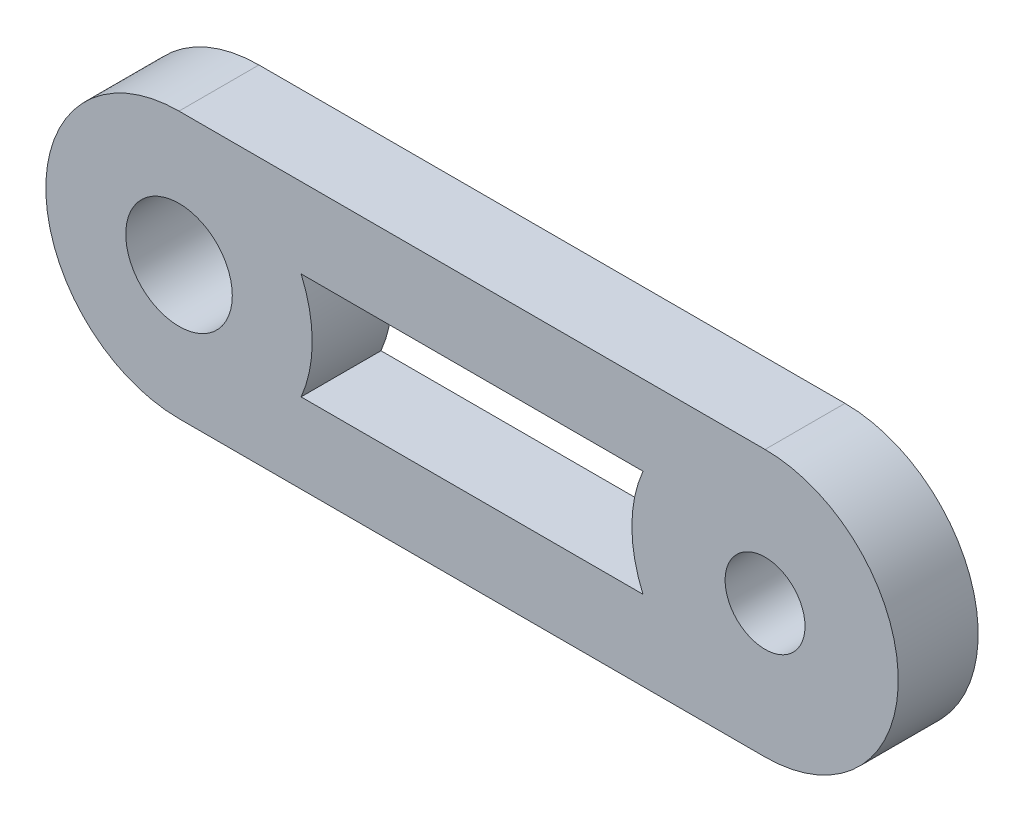
ISO-10303-21;
HEADER;
FILE_DESCRIPTION(('STEP AP214'),'2;1');
FILE_NAME('part.step','',(''),(''),'','','');
FILE_SCHEMA(('AUTOMOTIVE_DESIGN { 1 0 10303 214 1 1 1 1 }'));
ENDSEC;
DATA;
#1=APPLICATION_CONTEXT('core data for automotive mechanical design processes');
#2=APPLICATION_PROTOCOL_DEFINITION('international standard','automotive_design',2000,#1);
#3=PRODUCT_CONTEXT('',#1,'mechanical');
#4=PRODUCT('Part','Part','',(#3));
#5=PRODUCT_RELATED_PRODUCT_CATEGORY('part','',(#4));
#6=PRODUCT_DEFINITION_FORMATION('','',#4);
#7=PRODUCT_DEFINITION_CONTEXT('part definition',#1,'design');
#8=PRODUCT_DEFINITION('design','',#6,#7);
#9=PRODUCT_DEFINITION_SHAPE('','',#8);
#10=(LENGTH_UNIT() NAMED_UNIT(*) SI_UNIT(.MILLI.,.METRE.));
#11=(NAMED_UNIT(*) PLANE_ANGLE_UNIT() SI_UNIT($,.RADIAN.));
#12=(NAMED_UNIT(*) SI_UNIT($,.STERADIAN.) SOLID_ANGLE_UNIT());
#13=UNCERTAINTY_MEASURE_WITH_UNIT(LENGTH_MEASURE(1.E-05),#10,'distance_accuracy_value','');
#14=(GEOMETRIC_REPRESENTATION_CONTEXT(3) GLOBAL_UNCERTAINTY_ASSIGNED_CONTEXT((#13)) GLOBAL_UNIT_ASSIGNED_CONTEXT((#10,
#11,#12)) REPRESENTATION_CONTEXT('',''));
#15=CARTESIAN_POINT('',(0.,0.,0.));
#16=DIRECTION('',(0.,0.,1.));
#17=DIRECTION('',(1.,0.,0.));
#18=AXIS2_PLACEMENT_3D('',#15,#16,#17);
#19=CARTESIAN_POINT('',(11.,-5.,-3.));
#20=DIRECTION('',(0.,1.,0.));
#21=DIRECTION('',(0.,0.,-1.));
#22=AXIS2_PLACEMENT_3D('',#19,#20,#21);
#23=PLANE('',#22);
#24=DIRECTION('',(1.,0.,0.));
#25=VECTOR('',#24,1.);
#26=CARTESIAN_POINT('',(11.,-5.,0.));
#27=LINE('',#26,#25);
#28=CARTESIAN_POINT('',(0.,-5.,0.));
#29=VERTEX_POINT('',#28);
#30=CARTESIAN_POINT('',(22.,-5.,0.));
#31=VERTEX_POINT('',#30);
#32=EDGE_CURVE('E146',#29,#31,#27,.T.);
#33=ORIENTED_EDGE('',*,*,#32,.F.);
#34=DIRECTION('',(0.,0.,1.));
#35=VECTOR('',#34,1.);
#36=CARTESIAN_POINT('',(0.,-5.,-3.));
#37=LINE('',#36,#35);
#38=CARTESIAN_POINT('',(0.,-5.,-3.));
#39=VERTEX_POINT('',#38);
#40=EDGE_CURVE('E143',#39,#29,#37,.T.);
#41=ORIENTED_EDGE('',*,*,#40,.F.);
#42=DIRECTION('',(1.,0.,0.));
#43=VECTOR('',#42,1.);
#44=CARTESIAN_POINT('',(11.,-5.,-3.));
#45=LINE('',#44,#43);
#46=CARTESIAN_POINT('',(22.,-5.,-3.));
#47=VERTEX_POINT('',#46);
#48=EDGE_CURVE('E132',#39,#47,#45,.T.);
#49=ORIENTED_EDGE('',*,*,#48,.T.);
#50=DIRECTION('',(0.,0.,1.));
#51=VECTOR('',#50,1.);
#52=CARTESIAN_POINT('',(22.,-5.,-3.));
#53=LINE('',#52,#51);
#54=EDGE_CURVE('E163',#47,#31,#53,.T.);
#55=ORIENTED_EDGE('',*,*,#54,.T.);
#56=EDGE_LOOP('',(#33,#41,#49,#55));
#57=FACE_BOUND('',#56,.T.);
#58=ADVANCED_FACE('F34',(#57),#23,.F.);
#59=CARTESIAN_POINT('',(22.,0.,-3.));
#60=DIRECTION('',(0.,0.,1.));
#61=DIRECTION('',(-1.,0.,0.));
#62=AXIS2_PLACEMENT_3D('',#59,#60,#61);
#63=CYLINDRICAL_SURFACE('',#62,5.);
#64=CARTESIAN_POINT('',(22.,0.,0.));
#65=DIRECTION('',(0.,0.,1.));
#66=DIRECTION('',(1.,0.,0.));
#67=AXIS2_PLACEMENT_3D('',#64,#65,#66);
#68=CIRCLE('',#67,5.);
#69=CARTESIAN_POINT('',(22.,5.,0.));
#70=VERTEX_POINT('',#69);
#71=EDGE_CURVE('E149',#31,#70,#68,.T.);
#72=ORIENTED_EDGE('',*,*,#71,.F.);
#73=ORIENTED_EDGE('',*,*,#54,.F.);
#74=CARTESIAN_POINT('',(22.,0.,-3.));
#75=DIRECTION('',(0.,0.,1.));
#76=DIRECTION('',(1.,0.,0.));
#77=AXIS2_PLACEMENT_3D('',#74,#75,#76);
#78=CIRCLE('',#77,5.);
#79=CARTESIAN_POINT('',(22.,5.,-3.));
#80=VERTEX_POINT('',#79);
#81=EDGE_CURVE('E136',#47,#80,#78,.T.);
#82=ORIENTED_EDGE('',*,*,#81,.T.);
#83=DIRECTION('',(0.,0.,1.));
#84=VECTOR('',#83,1.);
#85=CARTESIAN_POINT('',(22.,5.,-3.));
#86=LINE('',#85,#84);
#87=EDGE_CURVE('E160',#80,#70,#86,.T.);
#88=ORIENTED_EDGE('',*,*,#87,.T.);
#89=EDGE_LOOP('',(#72,#73,#82,#88));
#90=FACE_BOUND('',#89,.T.);
#91=ADVANCED_FACE('F190',(#90),#63,.T.);
#92=CARTESIAN_POINT('',(11.,5.,-3.));
#93=DIRECTION('',(0.,1.,0.));
#94=DIRECTION('',(0.,0.,-1.));
#95=AXIS2_PLACEMENT_3D('',#92,#93,#94);
#96=PLANE('',#95);
#97=DIRECTION('',(1.,0.,0.));
#98=VECTOR('',#97,1.);
#99=CARTESIAN_POINT('',(11.,5.,0.));
#100=LINE('',#99,#98);
#101=CARTESIAN_POINT('',(0.,5.,0.));
#102=VERTEX_POINT('',#101);
#103=EDGE_CURVE('E152',#102,#70,#100,.T.);
#104=ORIENTED_EDGE('',*,*,#103,.T.);
#105=ORIENTED_EDGE('',*,*,#87,.F.);
#106=DIRECTION('',(1.,0.,0.));
#107=VECTOR('',#106,1.);
#108=CARTESIAN_POINT('',(11.,5.,-3.));
#109=LINE('',#108,#107);
#110=CARTESIAN_POINT('',(0.,5.,-3.));
#111=VERTEX_POINT('',#110);
#112=EDGE_CURVE('E139',#111,#80,#109,.T.);
#113=ORIENTED_EDGE('',*,*,#112,.F.);
#114=DIRECTION('',(0.,0.,1.));
#115=VECTOR('',#114,1.);
#116=CARTESIAN_POINT('',(0.,5.,-3.));
#117=LINE('',#116,#115);
#118=EDGE_CURVE('E157',#111,#102,#117,.T.);
#119=ORIENTED_EDGE('',*,*,#118,.T.);
#120=EDGE_LOOP('',(#104,#105,#113,#119));
#121=FACE_BOUND('',#120,.T.);
#122=ADVANCED_FACE('F195',(#121),#96,.T.);
#123=CARTESIAN_POINT('',(22.,0.,-3.));
#124=DIRECTION('',(0.,0.,1.));
#125=DIRECTION('',(-1.,0.,0.));
#126=AXIS2_PLACEMENT_3D('',#123,#124,#125);
#127=CYLINDRICAL_SURFACE('',#126,1.5);
#128=CARTESIAN_POINT('',(22.,0.,-3.));
#129=DIRECTION('',(0.,0.,1.));
#130=DIRECTION('',(1.,0.,0.));
#131=AXIS2_PLACEMENT_3D('',#128,#129,#130);
#132=CIRCLE('',#131,1.5);
#133=CARTESIAN_POINT('',(23.5,0.,-3.));
#134=VERTEX_POINT('',#133);
#135=EDGE_CURVE('E129',#134,#134,#132,.T.);
#136=ORIENTED_EDGE('',*,*,#135,.F.);
#137=EDGE_LOOP('',(#136));
#138=FACE_BOUND('',#137,.T.);
#139=CARTESIAN_POINT('',(22.,0.,0.));
#140=DIRECTION('',(0.,0.,1.));
#141=DIRECTION('',(1.,0.,0.));
#142=AXIS2_PLACEMENT_3D('',#139,#140,#141);
#143=CIRCLE('',#142,1.5);
#144=CARTESIAN_POINT('',(23.5,0.,0.));
#145=VERTEX_POINT('',#144);
#146=EDGE_CURVE('E126',#145,#145,#143,.T.);
#147=ORIENTED_EDGE('',*,*,#146,.T.);
#148=EDGE_LOOP('',(#147));
#149=FACE_BOUND('',#148,.T.);
#150=ADVANCED_FACE('F36',(#138,#149),#127,.F.);
#151=CARTESIAN_POINT('',(0.,0.,-3.));
#152=DIRECTION('',(0.,0.,1.));
#153=DIRECTION('',(-1.,0.,0.));
#154=AXIS2_PLACEMENT_3D('',#151,#152,#153);
#155=CYLINDRICAL_SURFACE('',#154,5.);
#156=CARTESIAN_POINT('',(0.,0.,0.));
#157=DIRECTION('',(0.,0.,1.));
#158=DIRECTION('',(1.,0.,0.));
#159=AXIS2_PLACEMENT_3D('',#156,#157,#158);
#160=CIRCLE('',#159,5.);
#161=EDGE_CURVE('E133',#29,#102,#160,.F.);
#162=ORIENTED_EDGE('',*,*,#161,.T.);
#163=ORIENTED_EDGE('',*,*,#118,.F.);
#164=CARTESIAN_POINT('',(0.,0.,-3.));
#165=DIRECTION('',(0.,0.,1.));
#166=DIRECTION('',(1.,0.,0.));
#167=AXIS2_PLACEMENT_3D('',#164,#165,#166);
#168=CIRCLE('',#167,5.);
#169=EDGE_CURVE('E141',#39,#111,#168,.F.);
#170=ORIENTED_EDGE('',*,*,#169,.F.);
#171=ORIENTED_EDGE('',*,*,#40,.T.);
#172=EDGE_LOOP('',(#162,#163,#170,#171));
#173=FACE_BOUND('',#172,.T.);
#174=ADVANCED_FACE('F203',(#173),#155,.T.);
#175=CARTESIAN_POINT('',(11.,-26.2186144567226,-3.));
#176=DIRECTION('',(0.,0.,-1.));
#177=DIRECTION('',(1.,0.,0.));
#178=AXIS2_PLACEMENT_3D('',#175,#176,#177);
#179=PLANE('',#178);
#180=CARTESIAN_POINT('',(0.,0.,-3.));
#181=DIRECTION('',(0.,0.,1.));
#182=DIRECTION('',(1.,0.,0.));
#183=AXIS2_PLACEMENT_3D('',#180,#181,#182);
#184=CIRCLE('',#183,2.);
#185=CARTESIAN_POINT('',(2.,0.,-3.));
#186=VERTEX_POINT('',#185);
#187=EDGE_CURVE('E212',#186,#186,#184,.T.);
#188=ORIENTED_EDGE('',*,*,#187,.T.);
#189=EDGE_LOOP('',(#188));
#190=FACE_BOUND('',#189,.T.);
#191=CARTESIAN_POINT('',(22.,0.,-3.));
#192=DIRECTION('',(0.,0.,-1.));
#193=DIRECTION('',(1.,0.,0.));
#194=AXIS2_PLACEMENT_3D('',#191,#192,#193);
#195=CIRCLE('',#194,5.);
#196=CARTESIAN_POINT('',(17.4174243050442,-2.,-3.));
#197=VERTEX_POINT('',#196);
#198=CARTESIAN_POINT('',(17.4174243050442,2.,-3.));
#199=VERTEX_POINT('',#198);
#200=EDGE_CURVE('E118',#197,#199,#195,.T.);
#201=ORIENTED_EDGE('',*,*,#200,.T.);
#202=DIRECTION('',(-1.,0.,0.));
#203=VECTOR('',#202,1.);
#204=CARTESIAN_POINT('',(17.4174243050442,2.,-3.));
#205=LINE('',#204,#203);
#206=CARTESIAN_POINT('',(4.58257569495584,2.,-3.));
#207=VERTEX_POINT('',#206);
#208=EDGE_CURVE('E101',#199,#207,#205,.T.);
#209=ORIENTED_EDGE('',*,*,#208,.T.);
#210=CARTESIAN_POINT('',(0.,0.,-3.));
#211=DIRECTION('',(0.,0.,-1.));
#212=DIRECTION('',(1.,0.,0.));
#213=AXIS2_PLACEMENT_3D('',#210,#211,#212);
#214=CIRCLE('',#213,5.);
#215=CARTESIAN_POINT('',(4.58257569495584,-2.,-3.));
#216=VERTEX_POINT('',#215);
#217=EDGE_CURVE('E109',#207,#216,#214,.T.);
#218=ORIENTED_EDGE('',*,*,#217,.T.);
#219=DIRECTION('',(1.,0.,0.));
#220=VECTOR('',#219,1.);
#221=CARTESIAN_POINT('',(4.58257569495584,-2.,-3.));
#222=LINE('',#221,#220);
#223=EDGE_CURVE('E114',#216,#197,#222,.T.);
#224=ORIENTED_EDGE('',*,*,#223,.T.);
#225=EDGE_LOOP('',(#201,#209,#218,#224));
#226=FACE_BOUND('',#225,.T.);
#227=ORIENTED_EDGE('',*,*,#135,.T.);
#228=EDGE_LOOP('',(#227));
#229=FACE_BOUND('',#228,.T.);
#230=ORIENTED_EDGE('',*,*,#48,.F.);
#231=ORIENTED_EDGE('',*,*,#169,.T.);
#232=ORIENTED_EDGE('',*,*,#112,.T.);
#233=ORIENTED_EDGE('',*,*,#81,.F.);
#234=EDGE_LOOP('',(#230,#231,#232,#233));
#235=FACE_BOUND('',#234,.T.);
#236=ADVANCED_FACE('F116',(#190,#226,#229,#235),#179,.T.);
#237=CARTESIAN_POINT('',(11.,-26.2186144567226,0.));
#238=DIRECTION('',(0.,0.,-1.));
#239=DIRECTION('',(1.,0.,0.));
#240=AXIS2_PLACEMENT_3D('',#237,#238,#239);
#241=PLANE('',#240);
#242=CARTESIAN_POINT('',(0.,0.,0.));
#243=DIRECTION('',(0.,0.,1.));
#244=DIRECTION('',(1.,0.,0.));
#245=AXIS2_PLACEMENT_3D('',#242,#243,#244);
#246=CIRCLE('',#245,2.);
#247=CARTESIAN_POINT('',(2.,0.,0.));
#248=VERTEX_POINT('',#247);
#249=EDGE_CURVE('E38',#248,#248,#246,.T.);
#250=ORIENTED_EDGE('',*,*,#249,.F.);
#251=EDGE_LOOP('',(#250));
#252=FACE_BOUND('',#251,.T.);
#253=DIRECTION('',(1.,0.,0.));
#254=VECTOR('',#253,1.);
#255=CARTESIAN_POINT('',(11.,-2.,0.));
#256=LINE('',#255,#254);
#257=CARTESIAN_POINT('',(4.58257569495584,-2.,0.));
#258=VERTEX_POINT('',#257);
#259=CARTESIAN_POINT('',(17.4174243050442,-2.,0.));
#260=VERTEX_POINT('',#259);
#261=EDGE_CURVE('E43',#258,#260,#256,.T.);
#262=ORIENTED_EDGE('',*,*,#261,.F.);
#263=CARTESIAN_POINT('',(0.,0.,0.));
#264=DIRECTION('',(0.,0.,1.));
#265=DIRECTION('',(1.,0.,0.));
#266=AXIS2_PLACEMENT_3D('',#263,#264,#265);
#267=CIRCLE('',#266,5.);
#268=CARTESIAN_POINT('',(4.58257569495584,2.,0.));
#269=VERTEX_POINT('',#268);
#270=EDGE_CURVE('E167',#269,#258,#267,.F.);
#271=ORIENTED_EDGE('',*,*,#270,.F.);
#272=DIRECTION('',(-1.,0.,0.));
#273=VECTOR('',#272,1.);
#274=CARTESIAN_POINT('',(11.,2.,0.));
#275=LINE('',#274,#273);
#276=CARTESIAN_POINT('',(17.4174243050442,2.,0.));
#277=VERTEX_POINT('',#276);
#278=EDGE_CURVE('E104',#277,#269,#275,.T.);
#279=ORIENTED_EDGE('',*,*,#278,.F.);
#280=CARTESIAN_POINT('',(22.,0.,0.));
#281=DIRECTION('',(0.,0.,1.));
#282=DIRECTION('',(1.,0.,0.));
#283=AXIS2_PLACEMENT_3D('',#280,#281,#282);
#284=CIRCLE('',#283,5.);
#285=EDGE_CURVE('E11',#260,#277,#284,.F.);
#286=ORIENTED_EDGE('',*,*,#285,.F.);
#287=EDGE_LOOP('',(#262,#271,#279,#286));
#288=FACE_BOUND('',#287,.T.);
#289=ORIENTED_EDGE('',*,*,#146,.F.);
#290=EDGE_LOOP('',(#289));
#291=FACE_BOUND('',#290,.T.);
#292=ORIENTED_EDGE('',*,*,#32,.T.);
#293=ORIENTED_EDGE('',*,*,#71,.T.);
#294=ORIENTED_EDGE('',*,*,#103,.F.);
#295=ORIENTED_EDGE('',*,*,#161,.F.);
#296=EDGE_LOOP('',(#292,#293,#294,#295));
#297=FACE_BOUND('',#296,.T.);
#298=ADVANCED_FACE('F175',(#252,#288,#291,#297),#241,.F.);
#299=CARTESIAN_POINT('',(22.,0.,7.));
#300=DIRECTION('',(0.,0.,-1.));
#301=DIRECTION('',(1.,0.,0.));
#302=AXIS2_PLACEMENT_3D('',#299,#300,#301);
#303=CYLINDRICAL_SURFACE('',#302,5.);
#304=DIRECTION('',(0.,0.,-1.));
#305=VECTOR('',#304,1.);
#306=CARTESIAN_POINT('',(17.4174243050442,-2.,7.));
#307=LINE('',#306,#305);
#308=EDGE_CURVE('E124',#260,#197,#307,.T.);
#309=ORIENTED_EDGE('',*,*,#308,.F.);
#310=ORIENTED_EDGE('',*,*,#285,.T.);
#311=DIRECTION('',(0.,0.,-1.));
#312=VECTOR('',#311,1.);
#313=CARTESIAN_POINT('',(17.4174243050442,2.,7.));
#314=LINE('',#313,#312);
#315=EDGE_CURVE('E49',#277,#199,#314,.T.);
#316=ORIENTED_EDGE('',*,*,#315,.T.);
#317=ORIENTED_EDGE('',*,*,#200,.F.);
#318=EDGE_LOOP('',(#309,#310,#316,#317));
#319=FACE_BOUND('',#318,.T.);
#320=ADVANCED_FACE('F177',(#319),#303,.T.);
#321=CARTESIAN_POINT('',(4.58257569495584,-2.,7.));
#322=DIRECTION('',(0.,-1.,0.));
#323=DIRECTION('',(0.,0.,1.));
#324=AXIS2_PLACEMENT_3D('',#321,#322,#323);
#325=PLANE('',#324);
#326=DIRECTION('',(0.,0.,-1.));
#327=VECTOR('',#326,1.);
#328=CARTESIAN_POINT('',(4.58257569495584,-2.,7.));
#329=LINE('',#328,#327);
#330=EDGE_CURVE('E106',#258,#216,#329,.T.);
#331=ORIENTED_EDGE('',*,*,#330,.F.);
#332=ORIENTED_EDGE('',*,*,#261,.T.);
#333=ORIENTED_EDGE('',*,*,#308,.T.);
#334=ORIENTED_EDGE('',*,*,#223,.F.);
#335=EDGE_LOOP('',(#331,#332,#333,#334));
#336=FACE_BOUND('',#335,.T.);
#337=ADVANCED_FACE('F172',(#336),#325,.F.);
#338=CARTESIAN_POINT('',(0.,0.,7.));
#339=DIRECTION('',(0.,0.,-1.));
#340=DIRECTION('',(1.,0.,0.));
#341=AXIS2_PLACEMENT_3D('',#338,#339,#340);
#342=CYLINDRICAL_SURFACE('',#341,5.);
#343=DIRECTION('',(0.,0.,-1.));
#344=VECTOR('',#343,1.);
#345=CARTESIAN_POINT('',(4.58257569495584,2.,7.));
#346=LINE('',#345,#344);
#347=EDGE_CURVE('E57',#269,#207,#346,.T.);
#348=ORIENTED_EDGE('',*,*,#347,.F.);
#349=ORIENTED_EDGE('',*,*,#270,.T.);
#350=ORIENTED_EDGE('',*,*,#330,.T.);
#351=ORIENTED_EDGE('',*,*,#217,.F.);
#352=EDGE_LOOP('',(#348,#349,#350,#351));
#353=FACE_BOUND('',#352,.T.);
#354=ADVANCED_FACE('F110',(#353),#342,.T.);
#355=CARTESIAN_POINT('',(17.4174243050442,2.,7.));
#356=DIRECTION('',(0.,1.,0.));
#357=DIRECTION('',(0.,0.,-1.));
#358=AXIS2_PLACEMENT_3D('',#355,#356,#357);
#359=PLANE('',#358);
#360=ORIENTED_EDGE('',*,*,#315,.F.);
#361=ORIENTED_EDGE('',*,*,#278,.T.);
#362=ORIENTED_EDGE('',*,*,#347,.T.);
#363=ORIENTED_EDGE('',*,*,#208,.F.);
#364=EDGE_LOOP('',(#360,#361,#362,#363));
#365=FACE_BOUND('',#364,.T.);
#366=ADVANCED_FACE('F99',(#365),#359,.F.);
#367=CARTESIAN_POINT('',(0.,0.,7.));
#368=DIRECTION('',(0.,0.,-1.));
#369=DIRECTION('',(1.,0.,0.));
#370=AXIS2_PLACEMENT_3D('',#367,#368,#369);
#371=CYLINDRICAL_SURFACE('',#370,2.);
#372=ORIENTED_EDGE('',*,*,#187,.F.);
#373=EDGE_LOOP('',(#372));
#374=FACE_BOUND('',#373,.T.);
#375=ORIENTED_EDGE('',*,*,#249,.T.);
#376=EDGE_LOOP('',(#375));
#377=FACE_BOUND('',#376,.T.);
#378=ADVANCED_FACE('F217',(#374,#377),#371,.F.);
#379=CLOSED_SHELL('',(#58,#91,#122,#150,#174,#236,#298,#320,#337,#354,#366,#378));
#380=MANIFOLD_SOLID_BREP('B2',#379);
#381=ADVANCED_BREP_SHAPE_REPRESENTATION('',(#18,#380),#14);
#382=SHAPE_DEFINITION_REPRESENTATION(#9,#381);
ENDSEC;
END-ISO-10303-21;
